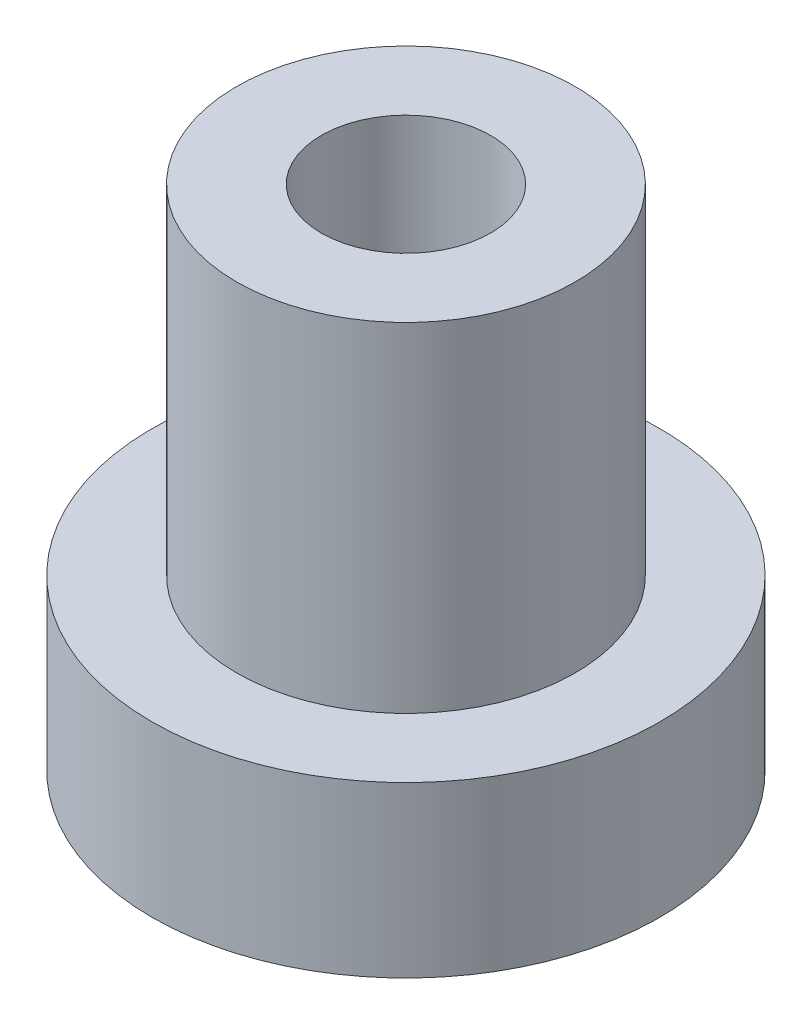
ISO-10303-21;
HEADER;
FILE_DESCRIPTION(('STEP AP214'),'2;1');
FILE_NAME('part.step','',(''),(''),'','','');
FILE_SCHEMA(('AUTOMOTIVE_DESIGN { 1 0 10303 214 1 1 1 1 }'));
ENDSEC;
DATA;
#1=APPLICATION_CONTEXT('core data for automotive mechanical design processes');
#2=APPLICATION_PROTOCOL_DEFINITION('international standard','automotive_design',2000,#1);
#3=PRODUCT_CONTEXT('',#1,'mechanical');
#4=PRODUCT('Part','Part','',(#3));
#5=PRODUCT_RELATED_PRODUCT_CATEGORY('part','',(#4));
#6=PRODUCT_DEFINITION_FORMATION('','',#4);
#7=PRODUCT_DEFINITION_CONTEXT('part definition',#1,'design');
#8=PRODUCT_DEFINITION('design','',#6,#7);
#9=PRODUCT_DEFINITION_SHAPE('','',#8);
#10=(LENGTH_UNIT() NAMED_UNIT(*) SI_UNIT(.MILLI.,.METRE.));
#11=(NAMED_UNIT(*) PLANE_ANGLE_UNIT() SI_UNIT($,.RADIAN.));
#12=(NAMED_UNIT(*) SI_UNIT($,.STERADIAN.) SOLID_ANGLE_UNIT());
#13=UNCERTAINTY_MEASURE_WITH_UNIT(LENGTH_MEASURE(1.E-05),#10,'distance_accuracy_value','');
#14=(GEOMETRIC_REPRESENTATION_CONTEXT(3) GLOBAL_UNCERTAINTY_ASSIGNED_CONTEXT((#13)) GLOBAL_UNIT_ASSIGNED_CONTEXT((#10,
#11,#12)) REPRESENTATION_CONTEXT('',''));
#15=CARTESIAN_POINT('',(0.,0.,0.));
#16=DIRECTION('',(0.,0.,1.));
#17=DIRECTION('',(1.,0.,0.));
#18=AXIS2_PLACEMENT_3D('',#15,#16,#17);
#19=CARTESIAN_POINT('',(0.,0.,0.));
#20=DIRECTION('',(0.,-1.,0.));
#21=DIRECTION('',(0.,0.,-1.));
#22=AXIS2_PLACEMENT_3D('',#19,#20,#21);
#23=PLANE('',#22);
#24=CARTESIAN_POINT('',(0.,0.,0.));
#25=DIRECTION('',(0.,1.,0.));
#26=DIRECTION('',(0.,0.,1.));
#27=AXIS2_PLACEMENT_3D('',#24,#25,#26);
#28=CIRCLE('',#27,9.525);
#29=CARTESIAN_POINT('',(0.,0.,9.525));
#30=VERTEX_POINT('',#29);
#31=EDGE_CURVE('E12',#30,#30,#28,.T.);
#32=ORIENTED_EDGE('',*,*,#31,.F.);
#33=EDGE_LOOP('',(#32));
#34=FACE_BOUND('',#33,.T.);
#35=ADVANCED_FACE('F43',(#34),#23,.T.);
#36=CARTESIAN_POINT('',(0.,0.,0.));
#37=DIRECTION('',(0.,1.,0.));
#38=DIRECTION('',(0.,0.,1.));
#39=AXIS2_PLACEMENT_3D('',#36,#37,#38);
#40=CYLINDRICAL_SURFACE('',#39,9.525);
#41=ORIENTED_EDGE('',*,*,#31,.T.);
#42=EDGE_LOOP('',(#41));
#43=FACE_BOUND('',#42,.T.);
#44=CARTESIAN_POINT('',(0.,6.35,0.));
#45=DIRECTION('',(0.,1.,0.));
#46=DIRECTION('',(0.,0.,1.));
#47=AXIS2_PLACEMENT_3D('',#44,#45,#46);
#48=CIRCLE('',#47,9.525);
#49=CARTESIAN_POINT('',(0.,6.35,9.525));
#50=VERTEX_POINT('',#49);
#51=EDGE_CURVE('E49',#50,#50,#48,.T.);
#52=ORIENTED_EDGE('',*,*,#51,.F.);
#53=EDGE_LOOP('',(#52));
#54=FACE_BOUND('',#53,.T.);
#55=ADVANCED_FACE('F85',(#43,#54),#40,.T.);
#56=CARTESIAN_POINT('',(-9.525,6.35,0.));
#57=DIRECTION('',(0.,1.,0.));
#58=DIRECTION('',(0.,0.,1.));
#59=AXIS2_PLACEMENT_3D('',#56,#57,#58);
#60=PLANE('',#59);
#61=ORIENTED_EDGE('',*,*,#51,.T.);
#62=EDGE_LOOP('',(#61));
#63=FACE_BOUND('',#62,.T.);
#64=CARTESIAN_POINT('',(0.,6.35,0.));
#65=DIRECTION('',(0.,1.,0.));
#66=DIRECTION('',(0.,0.,1.));
#67=AXIS2_PLACEMENT_3D('',#64,#65,#66);
#68=CIRCLE('',#67,6.35);
#69=CARTESIAN_POINT('',(0.,6.35,6.35));
#70=VERTEX_POINT('',#69);
#71=EDGE_CURVE('E53',#70,#70,#68,.T.);
#72=ORIENTED_EDGE('',*,*,#71,.F.);
#73=EDGE_LOOP('',(#72));
#74=FACE_BOUND('',#73,.T.);
#75=ADVANCED_FACE('F90',(#63,#74),#60,.T.);
#76=CARTESIAN_POINT('',(0.,0.,0.));
#77=DIRECTION('',(0.,1.,0.));
#78=DIRECTION('',(0.,0.,1.));
#79=AXIS2_PLACEMENT_3D('',#76,#77,#78);
#80=CYLINDRICAL_SURFACE('',#79,6.35);
#81=ORIENTED_EDGE('',*,*,#71,.T.);
#82=EDGE_LOOP('',(#81));
#83=FACE_BOUND('',#82,.T.);
#84=CARTESIAN_POINT('',(0.,19.05,0.));
#85=DIRECTION('',(0.,1.,0.));
#86=DIRECTION('',(0.,0.,1.));
#87=AXIS2_PLACEMENT_3D('',#84,#85,#86);
#88=CIRCLE('',#87,6.35);
#89=CARTESIAN_POINT('',(0.,19.05,6.35));
#90=VERTEX_POINT('',#89);
#91=EDGE_CURVE('E57',#90,#90,#88,.T.);
#92=ORIENTED_EDGE('',*,*,#91,.F.);
#93=EDGE_LOOP('',(#92));
#94=FACE_BOUND('',#93,.T.);
#95=ADVANCED_FACE('F81',(#83,#94),#80,.T.);
#96=CARTESIAN_POINT('',(-6.35,19.05,0.));
#97=DIRECTION('',(0.,1.,0.));
#98=DIRECTION('',(0.,0.,1.));
#99=AXIS2_PLACEMENT_3D('',#96,#97,#98);
#100=PLANE('',#99);
#101=ORIENTED_EDGE('',*,*,#91,.T.);
#102=EDGE_LOOP('',(#101));
#103=FACE_BOUND('',#102,.T.);
#104=CARTESIAN_POINT('',(0.,19.05,0.));
#105=DIRECTION('',(0.,1.,0.));
#106=DIRECTION('',(0.,0.,1.));
#107=AXIS2_PLACEMENT_3D('',#104,#105,#106);
#108=CIRCLE('',#107,3.175);
#109=CARTESIAN_POINT('',(0.,19.05,3.175));
#110=VERTEX_POINT('',#109);
#111=EDGE_CURVE('E62',#110,#110,#108,.T.);
#112=ORIENTED_EDGE('',*,*,#111,.F.);
#113=EDGE_LOOP('',(#112));
#114=FACE_BOUND('',#113,.T.);
#115=ADVANCED_FACE('F73',(#103,#114),#100,.T.);
#116=CARTESIAN_POINT('',(0.,0.,0.));
#117=DIRECTION('',(0.,1.,0.));
#118=DIRECTION('',(0.,0.,1.));
#119=AXIS2_PLACEMENT_3D('',#116,#117,#118);
#120=CYLINDRICAL_SURFACE('',#119,3.175);
#121=ORIENTED_EDGE('',*,*,#111,.T.);
#122=EDGE_LOOP('',(#121));
#123=FACE_BOUND('',#122,.T.);
#124=CARTESIAN_POINT('',(0.,6.35,0.));
#125=DIRECTION('',(0.,1.,0.));
#126=DIRECTION('',(0.,0.,1.));
#127=AXIS2_PLACEMENT_3D('',#124,#125,#126);
#128=CIRCLE('',#127,3.175);
#129=CARTESIAN_POINT('',(0.,6.35,3.175));
#130=VERTEX_POINT('',#129);
#131=EDGE_CURVE('E65',#130,#130,#128,.T.);
#132=ORIENTED_EDGE('',*,*,#131,.F.);
#133=EDGE_LOOP('',(#132));
#134=FACE_BOUND('',#133,.T.);
#135=ADVANCED_FACE('F71',(#123,#134),#120,.F.);
#136=CARTESIAN_POINT('',(-3.175,6.35,0.));
#137=DIRECTION('',(0.,1.,0.));
#138=DIRECTION('',(0.,0.,1.));
#139=AXIS2_PLACEMENT_3D('',#136,#137,#138);
#140=PLANE('',#139);
#141=ORIENTED_EDGE('',*,*,#131,.T.);
#142=EDGE_LOOP('',(#141));
#143=FACE_BOUND('',#142,.T.);
#144=ADVANCED_FACE('F69',(#143),#140,.T.);
#145=CLOSED_SHELL('',(#35,#55,#75,#95,#115,#135,#144));
#146=MANIFOLD_SOLID_BREP('B2',#145);
#147=ADVANCED_BREP_SHAPE_REPRESENTATION('',(#18,#146),#14);
#148=SHAPE_DEFINITION_REPRESENTATION(#9,#147);
ENDSEC;
END-ISO-10303-21;
